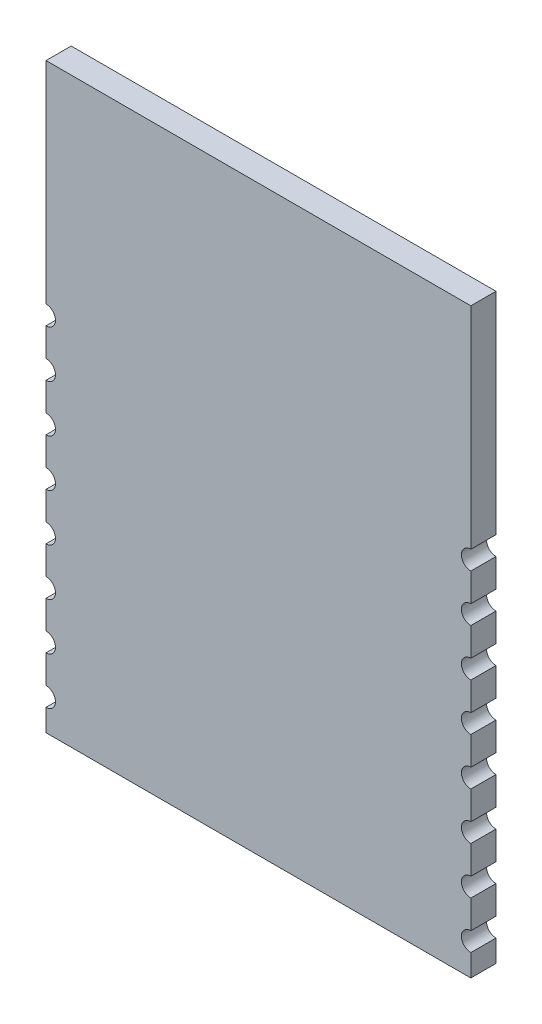
ISO-10303-21;
HEADER;
FILE_DESCRIPTION(('STEP AP214'),'2;1');
FILE_NAME('part.step','',(''),(''),'','','');
FILE_SCHEMA(('AUTOMOTIVE_DESIGN { 1 0 10303 214 1 1 1 1 }'));
ENDSEC;
DATA;
#1=APPLICATION_CONTEXT('core data for automotive mechanical design processes');
#2=APPLICATION_PROTOCOL_DEFINITION('international standard','automotive_design',2000,#1);
#3=PRODUCT_CONTEXT('',#1,'mechanical');
#4=PRODUCT('Part','Part','',(#3));
#5=PRODUCT_RELATED_PRODUCT_CATEGORY('part','',(#4));
#6=PRODUCT_DEFINITION_FORMATION('','',#4);
#7=PRODUCT_DEFINITION_CONTEXT('part definition',#1,'design');
#8=PRODUCT_DEFINITION('design','',#6,#7);
#9=PRODUCT_DEFINITION_SHAPE('','',#8);
#10=(LENGTH_UNIT() NAMED_UNIT(*) SI_UNIT(.MILLI.,.METRE.));
#11=(NAMED_UNIT(*) PLANE_ANGLE_UNIT() SI_UNIT($,.RADIAN.));
#12=(NAMED_UNIT(*) SI_UNIT($,.STERADIAN.) SOLID_ANGLE_UNIT());
#13=UNCERTAINTY_MEASURE_WITH_UNIT(LENGTH_MEASURE(1.E-05),#10,'distance_accuracy_value','');
#14=(GEOMETRIC_REPRESENTATION_CONTEXT(3) GLOBAL_UNCERTAINTY_ASSIGNED_CONTEXT((#13)) GLOBAL_UNIT_ASSIGNED_CONTEXT((#10,
#11,#12)) REPRESENTATION_CONTEXT('',''));
#15=CARTESIAN_POINT('',(0.,0.,0.));
#16=DIRECTION('',(0.,0.,1.));
#17=DIRECTION('',(1.,0.,0.));
#18=AXIS2_PLACEMENT_3D('',#15,#16,#17);
#19=CARTESIAN_POINT('',(0.,18.5,0.8));
#20=DIRECTION('',(1.,0.,0.));
#21=DIRECTION('',(0.,0.,-1.));
#22=AXIS2_PLACEMENT_3D('',#19,#20,#21);
#23=PLANE('',#22);
#24=DIRECTION('',(0.,0.,1.));
#25=VECTOR('',#24,1.);
#26=CARTESIAN_POINT('',(0.,1.3,0.));
#27=LINE('',#26,#25);
#28=CARTESIAN_POINT('',(0.,1.3,0.8));
#29=VERTEX_POINT('',#28);
#30=CARTESIAN_POINT('',(0.,1.3,0.));
#31=VERTEX_POINT('',#30);
#32=EDGE_CURVE('E64',#29,#31,#27,.F.);
#33=ORIENTED_EDGE('',*,*,#32,.F.);
#34=DIRECTION('',(0.,-1.,0.));
#35=VECTOR('',#34,1.);
#36=CARTESIAN_POINT('',(0.,18.5,0.8));
#37=LINE('',#36,#35);
#38=CARTESIAN_POINT('',(0.,2.2,0.8));
#39=VERTEX_POINT('',#38);
#40=EDGE_CURVE('E713',#39,#29,#37,.T.);
#41=ORIENTED_EDGE('',*,*,#40,.F.);
#42=DIRECTION('',(0.,0.,1.));
#43=VECTOR('',#42,1.);
#44=CARTESIAN_POINT('',(0.,2.2,0.));
#45=LINE('',#44,#43);
#46=CARTESIAN_POINT('',(0.,2.2,0.));
#47=VERTEX_POINT('',#46);
#48=EDGE_CURVE('E563',#47,#39,#45,.T.);
#49=ORIENTED_EDGE('',*,*,#48,.F.);
#50=DIRECTION('',(0.,-1.,0.));
#51=VECTOR('',#50,1.);
#52=CARTESIAN_POINT('',(0.,18.5,0.));
#53=LINE('',#52,#51);
#54=EDGE_CURVE('E651',#47,#31,#53,.T.);
#55=ORIENTED_EDGE('',*,*,#54,.T.);
#56=EDGE_LOOP('',(#33,#41,#49,#55));
#57=FACE_BOUND('',#56,.T.);
#58=ADVANCED_FACE('F49',(#57),#23,.F.);
#59=DIRECTION('',(0.,0.,1.));
#60=VECTOR('',#59,1.);
#61=CARTESIAN_POINT('',(0.,0.7,0.));
#62=LINE('',#61,#60);
#63=CARTESIAN_POINT('',(0.,0.7,0.));
#64=VERTEX_POINT('',#63);
#65=CARTESIAN_POINT('',(0.,0.7,0.8));
#66=VERTEX_POINT('',#65);
#67=EDGE_CURVE('E558',#64,#66,#62,.T.);
#68=ORIENTED_EDGE('',*,*,#67,.F.);
#69=CARTESIAN_POINT('',(0.,0.,0.));
#70=VERTEX_POINT('',#69);
#71=EDGE_CURVE('E320',#64,#70,#53,.T.);
#72=ORIENTED_EDGE('',*,*,#71,.T.);
#73=DIRECTION('',(0.,0.,-1.));
#74=VECTOR('',#73,1.);
#75=CARTESIAN_POINT('',(0.,0.,0.8));
#76=LINE('',#75,#74);
#77=CARTESIAN_POINT('',(0.,0.,0.8));
#78=VERTEX_POINT('',#77);
#79=EDGE_CURVE('E11',#78,#70,#76,.T.);
#80=ORIENTED_EDGE('',*,*,#79,.F.);
#81=EDGE_CURVE('E339',#66,#78,#37,.T.);
#82=ORIENTED_EDGE('',*,*,#81,.F.);
#83=EDGE_LOOP('',(#68,#72,#80,#82));
#84=FACE_BOUND('',#83,.T.);
#85=ADVANCED_FACE('F649',(#84),#23,.F.);
#86=DIRECTION('',(0.,0.,1.));
#87=VECTOR('',#86,1.);
#88=CARTESIAN_POINT('',(0.,2.8,0.));
#89=LINE('',#88,#87);
#90=CARTESIAN_POINT('',(0.,2.8,0.8));
#91=VERTEX_POINT('',#90);
#92=CARTESIAN_POINT('',(0.,2.8,0.));
#93=VERTEX_POINT('',#92);
#94=EDGE_CURVE('E72',#91,#93,#89,.F.);
#95=ORIENTED_EDGE('',*,*,#94,.F.);
#96=CARTESIAN_POINT('',(0.,3.7,0.8));
#97=VERTEX_POINT('',#96);
#98=EDGE_CURVE('E708',#97,#91,#37,.T.);
#99=ORIENTED_EDGE('',*,*,#98,.F.);
#100=DIRECTION('',(0.,0.,1.));
#101=VECTOR('',#100,1.);
#102=CARTESIAN_POINT('',(0.,3.7,0.));
#103=LINE('',#102,#101);
#104=CARTESIAN_POINT('',(0.,3.7,0.));
#105=VERTEX_POINT('',#104);
#106=EDGE_CURVE('E569',#105,#97,#103,.T.);
#107=ORIENTED_EDGE('',*,*,#106,.F.);
#108=EDGE_CURVE('E654',#105,#93,#53,.T.);
#109=ORIENTED_EDGE('',*,*,#108,.T.);
#110=EDGE_LOOP('',(#95,#99,#107,#109));
#111=FACE_BOUND('',#110,.T.);
#112=ADVANCED_FACE('F736',(#111),#23,.F.);
#113=DIRECTION('',(0.,0.,1.));
#114=VECTOR('',#113,1.);
#115=CARTESIAN_POINT('',(0.,4.3,0.));
#116=LINE('',#115,#114);
#117=CARTESIAN_POINT('',(0.,4.3,0.8));
#118=VERTEX_POINT('',#117);
#119=CARTESIAN_POINT('',(0.,4.3,0.));
#120=VERTEX_POINT('',#119);
#121=EDGE_CURVE('E566',#118,#120,#116,.F.);
#122=ORIENTED_EDGE('',*,*,#121,.F.);
#123=CARTESIAN_POINT('',(0.,5.2,0.8));
#124=VERTEX_POINT('',#123);
#125=EDGE_CURVE('E702',#124,#118,#37,.T.);
#126=ORIENTED_EDGE('',*,*,#125,.F.);
#127=DIRECTION('',(0.,0.,1.));
#128=VECTOR('',#127,1.);
#129=CARTESIAN_POINT('',(0.,5.2,0.));
#130=LINE('',#129,#128);
#131=CARTESIAN_POINT('',(0.,5.2,0.));
#132=VERTEX_POINT('',#131);
#133=EDGE_CURVE('E575',#132,#124,#130,.T.);
#134=ORIENTED_EDGE('',*,*,#133,.F.);
#135=EDGE_CURVE('E661',#132,#120,#53,.T.);
#136=ORIENTED_EDGE('',*,*,#135,.T.);
#137=EDGE_LOOP('',(#122,#126,#134,#136));
#138=FACE_BOUND('',#137,.T.);
#139=ADVANCED_FACE('F917',(#138),#23,.F.);
#140=DIRECTION('',(0.,0.,1.));
#141=VECTOR('',#140,1.);
#142=CARTESIAN_POINT('',(0.,5.8,0.));
#143=LINE('',#142,#141);
#144=CARTESIAN_POINT('',(0.,5.8,0.8));
#145=VERTEX_POINT('',#144);
#146=CARTESIAN_POINT('',(0.,5.8,0.));
#147=VERTEX_POINT('',#146);
#148=EDGE_CURVE('E572',#145,#147,#143,.F.);
#149=ORIENTED_EDGE('',*,*,#148,.F.);
#150=CARTESIAN_POINT('',(0.,6.7,0.8));
#151=VERTEX_POINT('',#150);
#152=EDGE_CURVE('E699',#151,#145,#37,.T.);
#153=ORIENTED_EDGE('',*,*,#152,.F.);
#154=DIRECTION('',(0.,0.,1.));
#155=VECTOR('',#154,1.);
#156=CARTESIAN_POINT('',(0.,6.7,0.));
#157=LINE('',#156,#155);
#158=CARTESIAN_POINT('',(0.,6.7,0.));
#159=VERTEX_POINT('',#158);
#160=EDGE_CURVE('E580',#159,#151,#157,.T.);
#161=ORIENTED_EDGE('',*,*,#160,.F.);
#162=EDGE_CURVE('E668',#159,#147,#53,.T.);
#163=ORIENTED_EDGE('',*,*,#162,.T.);
#164=EDGE_LOOP('',(#149,#153,#161,#163));
#165=FACE_BOUND('',#164,.T.);
#166=ADVANCED_FACE('F697',(#165),#23,.F.);
#167=DIRECTION('',(0.,0.,1.));
#168=VECTOR('',#167,1.);
#169=CARTESIAN_POINT('',(0.,7.3,0.));
#170=LINE('',#169,#168);
#171=CARTESIAN_POINT('',(0.,7.3,0.8));
#172=VERTEX_POINT('',#171);
#173=CARTESIAN_POINT('',(0.,7.3,0.));
#174=VERTEX_POINT('',#173);
#175=EDGE_CURVE('E578',#172,#174,#170,.F.);
#176=ORIENTED_EDGE('',*,*,#175,.F.);
#177=CARTESIAN_POINT('',(0.,8.2,0.8));
#178=VERTEX_POINT('',#177);
#179=EDGE_CURVE('E701',#178,#172,#37,.T.);
#180=ORIENTED_EDGE('',*,*,#179,.F.);
#181=DIRECTION('',(0.,0.,1.));
#182=VECTOR('',#181,1.);
#183=CARTESIAN_POINT('',(0.,8.2,0.));
#184=LINE('',#183,#182);
#185=CARTESIAN_POINT('',(0.,8.2,0.));
#186=VERTEX_POINT('',#185);
#187=EDGE_CURVE('E586',#186,#178,#184,.T.);
#188=ORIENTED_EDGE('',*,*,#187,.F.);
#189=EDGE_CURVE('E323',#186,#174,#53,.T.);
#190=ORIENTED_EDGE('',*,*,#189,.T.);
#191=EDGE_LOOP('',(#176,#180,#188,#190));
#192=FACE_BOUND('',#191,.T.);
#193=ADVANCED_FACE('F688',(#192),#23,.F.);
#194=DIRECTION('',(0.,0.,1.));
#195=VECTOR('',#194,1.);
#196=CARTESIAN_POINT('',(0.,8.8,0.));
#197=LINE('',#196,#195);
#198=CARTESIAN_POINT('',(0.,8.8,0.8));
#199=VERTEX_POINT('',#198);
#200=CARTESIAN_POINT('',(0.,8.8,0.));
#201=VERTEX_POINT('',#200);
#202=EDGE_CURVE('E583',#199,#201,#197,.F.);
#203=ORIENTED_EDGE('',*,*,#202,.F.);
#204=CARTESIAN_POINT('',(0.,9.7,0.8));
#205=VERTEX_POINT('',#204);
#206=EDGE_CURVE('E705',#205,#199,#37,.T.);
#207=ORIENTED_EDGE('',*,*,#206,.F.);
#208=DIRECTION('',(0.,0.,1.));
#209=VECTOR('',#208,1.);
#210=CARTESIAN_POINT('',(0.,9.7,0.));
#211=LINE('',#210,#209);
#212=CARTESIAN_POINT('',(0.,9.7,0.));
#213=VERTEX_POINT('',#212);
#214=EDGE_CURVE('E592',#213,#205,#211,.T.);
#215=ORIENTED_EDGE('',*,*,#214,.F.);
#216=EDGE_CURVE('E313',#213,#201,#53,.T.);
#217=ORIENTED_EDGE('',*,*,#216,.T.);
#218=EDGE_LOOP('',(#203,#207,#215,#217));
#219=FACE_BOUND('',#218,.T.);
#220=ADVANCED_FACE('F743',(#219),#23,.F.);
#221=DIRECTION('',(0.,0.,1.));
#222=VECTOR('',#221,1.);
#223=CARTESIAN_POINT('',(0.,10.3,0.));
#224=LINE('',#223,#222);
#225=CARTESIAN_POINT('',(0.,10.3,0.8));
#226=VERTEX_POINT('',#225);
#227=CARTESIAN_POINT('',(0.,10.3,0.));
#228=VERTEX_POINT('',#227);
#229=EDGE_CURVE('E589',#226,#228,#224,.F.);
#230=ORIENTED_EDGE('',*,*,#229,.F.);
#231=CARTESIAN_POINT('',(0.,11.2,0.8));
#232=VERTEX_POINT('',#231);
#233=EDGE_CURVE('E303',#232,#226,#37,.T.);
#234=ORIENTED_EDGE('',*,*,#233,.F.);
#235=DIRECTION('',(0.,0.,1.));
#236=VECTOR('',#235,1.);
#237=CARTESIAN_POINT('',(0.,11.2,0.));
#238=LINE('',#237,#236);
#239=CARTESIAN_POINT('',(0.,11.2,0.));
#240=VERTEX_POINT('',#239);
#241=EDGE_CURVE('E284',#240,#232,#238,.T.);
#242=ORIENTED_EDGE('',*,*,#241,.F.);
#243=EDGE_CURVE('E301',#240,#228,#53,.T.);
#244=ORIENTED_EDGE('',*,*,#243,.T.);
#245=EDGE_LOOP('',(#230,#234,#242,#244));
#246=FACE_BOUND('',#245,.T.);
#247=ADVANCED_FACE('F300',(#246),#23,.F.);
#248=DIRECTION('',(0.,0.,1.));
#249=VECTOR('',#248,1.);
#250=CARTESIAN_POINT('',(0.,11.8,0.));
#251=LINE('',#250,#249);
#252=CARTESIAN_POINT('',(0.,11.8,0.8));
#253=VERTEX_POINT('',#252);
#254=CARTESIAN_POINT('',(0.,11.8,0.));
#255=VERTEX_POINT('',#254);
#256=EDGE_CURVE('E287',#253,#255,#251,.F.);
#257=ORIENTED_EDGE('',*,*,#256,.F.);
#258=CARTESIAN_POINT('',(0.,18.5,0.8));
#259=VERTEX_POINT('',#258);
#260=EDGE_CURVE('E387',#259,#253,#37,.T.);
#261=ORIENTED_EDGE('',*,*,#260,.F.);
#262=DIRECTION('',(0.,0.,-1.));
#263=VECTOR('',#262,1.);
#264=CARTESIAN_POINT('',(0.,18.5,0.8));
#265=LINE('',#264,#263);
#266=CARTESIAN_POINT('',(0.,18.5,0.));
#267=VERTEX_POINT('',#266);
#268=EDGE_CURVE('E340',#259,#267,#265,.T.);
#269=ORIENTED_EDGE('',*,*,#268,.T.);
#270=EDGE_CURVE('E312',#267,#255,#53,.T.);
#271=ORIENTED_EDGE('',*,*,#270,.T.);
#272=EDGE_LOOP('',(#257,#261,#269,#271));
#273=FACE_BOUND('',#272,.T.);
#274=ADVANCED_FACE('F733',(#273),#23,.F.);
#275=CARTESIAN_POINT('',(13.5,18.5,0.8));
#276=DIRECTION('',(-1.,0.,0.));
#277=DIRECTION('',(0.,-1.,0.));
#278=AXIS2_PLACEMENT_3D('',#275,#276,#277);
#279=PLANE('',#278);
#280=DIRECTION('',(0.,1.,0.));
#281=VECTOR('',#280,1.);
#282=CARTESIAN_POINT('',(13.5,18.5,0.));
#283=LINE('',#282,#281);
#284=CARTESIAN_POINT('',(13.5,1.3,0.));
#285=VERTEX_POINT('',#284);
#286=CARTESIAN_POINT('',(13.5,2.2,0.));
#287=VERTEX_POINT('',#286);
#288=EDGE_CURVE('E336',#285,#287,#283,.T.);
#289=ORIENTED_EDGE('',*,*,#288,.T.);
#290=DIRECTION('',(0.,0.,1.));
#291=VECTOR('',#290,1.);
#292=CARTESIAN_POINT('',(13.5,2.2,0.));
#293=LINE('',#292,#291);
#294=CARTESIAN_POINT('',(13.5,2.2,0.8));
#295=VERTEX_POINT('',#294);
#296=EDGE_CURVE('E380',#287,#295,#293,.T.);
#297=ORIENTED_EDGE('',*,*,#296,.T.);
#298=DIRECTION('',(0.,1.,0.));
#299=VECTOR('',#298,1.);
#300=CARTESIAN_POINT('',(13.5,18.5,0.8));
#301=LINE('',#300,#299);
#302=CARTESIAN_POINT('',(13.5,1.3,0.8));
#303=VERTEX_POINT('',#302);
#304=EDGE_CURVE('E395',#303,#295,#301,.T.);
#305=ORIENTED_EDGE('',*,*,#304,.F.);
#306=DIRECTION('',(0.,0.,1.));
#307=VECTOR('',#306,1.);
#308=CARTESIAN_POINT('',(13.5,1.3,0.));
#309=LINE('',#308,#307);
#310=EDGE_CURVE('E372',#303,#285,#309,.F.);
#311=ORIENTED_EDGE('',*,*,#310,.T.);
#312=EDGE_LOOP('',(#289,#297,#305,#311));
#313=FACE_BOUND('',#312,.T.);
#314=ADVANCED_FACE('F730',(#313),#279,.F.);
#315=CARTESIAN_POINT('',(13.5,2.8,0.8));
#316=VERTEX_POINT('',#315);
#317=CARTESIAN_POINT('',(13.5,3.7,0.8));
#318=VERTEX_POINT('',#317);
#319=EDGE_CURVE('E403',#316,#318,#301,.T.);
#320=ORIENTED_EDGE('',*,*,#319,.F.);
#321=DIRECTION('',(0.,0.,1.));
#322=VECTOR('',#321,1.);
#323=CARTESIAN_POINT('',(13.5,2.8,0.));
#324=LINE('',#323,#322);
#325=CARTESIAN_POINT('',(13.5,2.8,0.));
#326=VERTEX_POINT('',#325);
#327=EDGE_CURVE('E462',#316,#326,#324,.F.);
#328=ORIENTED_EDGE('',*,*,#327,.T.);
#329=CARTESIAN_POINT('',(13.5,3.7,0.));
#330=VERTEX_POINT('',#329);
#331=EDGE_CURVE('E465',#326,#330,#283,.T.);
#332=ORIENTED_EDGE('',*,*,#331,.T.);
#333=DIRECTION('',(0.,0.,1.));
#334=VECTOR('',#333,1.);
#335=CARTESIAN_POINT('',(13.5,3.7,0.));
#336=LINE('',#335,#334);
#337=EDGE_CURVE('E464',#330,#318,#336,.T.);
#338=ORIENTED_EDGE('',*,*,#337,.T.);
#339=EDGE_LOOP('',(#320,#328,#332,#338));
#340=FACE_BOUND('',#339,.T.);
#341=ADVANCED_FACE('F460',(#340),#279,.F.);
#342=CARTESIAN_POINT('',(13.5,4.3,0.8));
#343=VERTEX_POINT('',#342);
#344=CARTESIAN_POINT('',(13.5,5.2,0.8));
#345=VERTEX_POINT('',#344);
#346=EDGE_CURVE('E436',#343,#345,#301,.T.);
#347=ORIENTED_EDGE('',*,*,#346,.F.);
#348=DIRECTION('',(0.,0.,1.));
#349=VECTOR('',#348,1.);
#350=CARTESIAN_POINT('',(13.5,4.3,0.));
#351=LINE('',#350,#349);
#352=CARTESIAN_POINT('',(13.5,4.3,0.));
#353=VERTEX_POINT('',#352);
#354=EDGE_CURVE('E469',#343,#353,#351,.F.);
#355=ORIENTED_EDGE('',*,*,#354,.T.);
#356=CARTESIAN_POINT('',(13.5,5.2,0.));
#357=VERTEX_POINT('',#356);
#358=EDGE_CURVE('E771',#353,#357,#283,.T.);
#359=ORIENTED_EDGE('',*,*,#358,.T.);
#360=DIRECTION('',(0.,0.,1.));
#361=VECTOR('',#360,1.);
#362=CARTESIAN_POINT('',(13.5,5.2,0.));
#363=LINE('',#362,#361);
#364=EDGE_CURVE('E476',#357,#345,#363,.T.);
#365=ORIENTED_EDGE('',*,*,#364,.T.);
#366=EDGE_LOOP('',(#347,#355,#359,#365));
#367=FACE_BOUND('',#366,.T.);
#368=ADVANCED_FACE('F1037',(#367),#279,.F.);
#369=CARTESIAN_POINT('',(13.5,5.8,0.8));
#370=VERTEX_POINT('',#369);
#371=CARTESIAN_POINT('',(13.5,6.7,0.8));
#372=VERTEX_POINT('',#371);
#373=EDGE_CURVE('E428',#370,#372,#301,.T.);
#374=ORIENTED_EDGE('',*,*,#373,.F.);
#375=DIRECTION('',(0.,0.,1.));
#376=VECTOR('',#375,1.);
#377=CARTESIAN_POINT('',(13.5,5.8,0.));
#378=LINE('',#377,#376);
#379=CARTESIAN_POINT('',(13.5,5.8,0.));
#380=VERTEX_POINT('',#379);
#381=EDGE_CURVE('E482',#370,#380,#378,.F.);
#382=ORIENTED_EDGE('',*,*,#381,.T.);
#383=CARTESIAN_POINT('',(13.5,6.7,0.));
#384=VERTEX_POINT('',#383);
#385=EDGE_CURVE('E766',#380,#384,#283,.T.);
#386=ORIENTED_EDGE('',*,*,#385,.T.);
#387=DIRECTION('',(0.,0.,1.));
#388=VECTOR('',#387,1.);
#389=CARTESIAN_POINT('',(13.5,6.7,0.));
#390=LINE('',#389,#388);
#391=EDGE_CURVE('E485',#384,#372,#390,.T.);
#392=ORIENTED_EDGE('',*,*,#391,.T.);
#393=EDGE_LOOP('',(#374,#382,#386,#392));
#394=FACE_BOUND('',#393,.T.);
#395=ADVANCED_FACE('F1045',(#394),#279,.F.);
#396=CARTESIAN_POINT('',(13.5,7.3,0.8));
#397=VERTEX_POINT('',#396);
#398=CARTESIAN_POINT('',(13.5,8.2,0.8));
#399=VERTEX_POINT('',#398);
#400=EDGE_CURVE('E421',#397,#399,#301,.T.);
#401=ORIENTED_EDGE('',*,*,#400,.F.);
#402=DIRECTION('',(0.,0.,1.));
#403=VECTOR('',#402,1.);
#404=CARTESIAN_POINT('',(13.5,7.3,0.));
#405=LINE('',#404,#403);
#406=CARTESIAN_POINT('',(13.5,7.3,0.));
#407=VERTEX_POINT('',#406);
#408=EDGE_CURVE('E488',#397,#407,#405,.F.);
#409=ORIENTED_EDGE('',*,*,#408,.T.);
#410=CARTESIAN_POINT('',(13.5,8.2,0.));
#411=VERTEX_POINT('',#410);
#412=EDGE_CURVE('E760',#407,#411,#283,.T.);
#413=ORIENTED_EDGE('',*,*,#412,.T.);
#414=DIRECTION('',(0.,0.,1.));
#415=VECTOR('',#414,1.);
#416=CARTESIAN_POINT('',(13.5,8.2,0.));
#417=LINE('',#416,#415);
#418=EDGE_CURVE('E492',#411,#399,#417,.T.);
#419=ORIENTED_EDGE('',*,*,#418,.T.);
#420=EDGE_LOOP('',(#401,#409,#413,#419));
#421=FACE_BOUND('',#420,.T.);
#422=ADVANCED_FACE('F1054',(#421),#279,.F.);
#423=CARTESIAN_POINT('',(13.5,8.8,0.8));
#424=VERTEX_POINT('',#423);
#425=CARTESIAN_POINT('',(13.5,9.7,0.8));
#426=VERTEX_POINT('',#425);
#427=EDGE_CURVE('E413',#424,#426,#301,.T.);
#428=ORIENTED_EDGE('',*,*,#427,.F.);
#429=DIRECTION('',(0.,0.,1.));
#430=VECTOR('',#429,1.);
#431=CARTESIAN_POINT('',(13.5,8.8,0.));
#432=LINE('',#431,#430);
#433=CARTESIAN_POINT('',(13.5,8.8,0.));
#434=VERTEX_POINT('',#433);
#435=EDGE_CURVE('E496',#424,#434,#432,.F.);
#436=ORIENTED_EDGE('',*,*,#435,.T.);
#437=CARTESIAN_POINT('',(13.5,9.7,0.));
#438=VERTEX_POINT('',#437);
#439=EDGE_CURVE('E755',#434,#438,#283,.T.);
#440=ORIENTED_EDGE('',*,*,#439,.T.);
#441=DIRECTION('',(0.,0.,1.));
#442=VECTOR('',#441,1.);
#443=CARTESIAN_POINT('',(13.5,9.7,0.));
#444=LINE('',#443,#442);
#445=EDGE_CURVE('E500',#438,#426,#444,.T.);
#446=ORIENTED_EDGE('',*,*,#445,.T.);
#447=EDGE_LOOP('',(#428,#436,#440,#446));
#448=FACE_BOUND('',#447,.T.);
#449=ADVANCED_FACE('F1062',(#448),#279,.F.);
#450=CARTESIAN_POINT('',(13.5,10.3,0.8));
#451=VERTEX_POINT('',#450);
#452=CARTESIAN_POINT('',(13.5,11.2,0.8));
#453=VERTEX_POINT('',#452);
#454=EDGE_CURVE('E405',#451,#453,#301,.T.);
#455=ORIENTED_EDGE('',*,*,#454,.F.);
#456=DIRECTION('',(0.,0.,1.));
#457=VECTOR('',#456,1.);
#458=CARTESIAN_POINT('',(13.5,10.3,0.));
#459=LINE('',#458,#457);
#460=CARTESIAN_POINT('',(13.5,10.3,0.));
#461=VERTEX_POINT('',#460);
#462=EDGE_CURVE('E503',#451,#461,#459,.F.);
#463=ORIENTED_EDGE('',*,*,#462,.T.);
#464=CARTESIAN_POINT('',(13.5,11.2,0.));
#465=VERTEX_POINT('',#464);
#466=EDGE_CURVE('E752',#461,#465,#283,.T.);
#467=ORIENTED_EDGE('',*,*,#466,.T.);
#468=DIRECTION('',(0.,0.,1.));
#469=VECTOR('',#468,1.);
#470=CARTESIAN_POINT('',(13.5,11.2,0.));
#471=LINE('',#470,#469);
#472=EDGE_CURVE('E507',#465,#453,#471,.T.);
#473=ORIENTED_EDGE('',*,*,#472,.T.);
#474=EDGE_LOOP('',(#455,#463,#467,#473));
#475=FACE_BOUND('',#474,.T.);
#476=ADVANCED_FACE('F731',(#475),#279,.F.);
#477=CARTESIAN_POINT('',(13.5,0.,0.));
#478=VERTEX_POINT('',#477);
#479=CARTESIAN_POINT('',(13.5,0.7,0.));
#480=VERTEX_POINT('',#479);
#481=EDGE_CURVE('E331',#478,#480,#283,.T.);
#482=ORIENTED_EDGE('',*,*,#481,.T.);
#483=DIRECTION('',(0.,0.,1.));
#484=VECTOR('',#483,1.);
#485=CARTESIAN_POINT('',(13.5,0.7,0.));
#486=LINE('',#485,#484);
#487=CARTESIAN_POINT('',(13.5,0.7,0.8));
#488=VERTEX_POINT('',#487);
#489=EDGE_CURVE('E378',#480,#488,#486,.T.);
#490=ORIENTED_EDGE('',*,*,#489,.T.);
#491=CARTESIAN_POINT('',(13.5,0.,0.8));
#492=VERTEX_POINT('',#491);
#493=EDGE_CURVE('E359',#492,#488,#301,.T.);
#494=ORIENTED_EDGE('',*,*,#493,.F.);
#495=DIRECTION('',(0.,0.,-1.));
#496=VECTOR('',#495,1.);
#497=CARTESIAN_POINT('',(13.5,0.,0.8));
#498=LINE('',#497,#496);
#499=EDGE_CURVE('E57',#492,#478,#498,.T.);
#500=ORIENTED_EDGE('',*,*,#499,.T.);
#501=EDGE_LOOP('',(#482,#490,#494,#500));
#502=FACE_BOUND('',#501,.T.);
#503=ADVANCED_FACE('F356',(#502),#279,.F.);
#504=CARTESIAN_POINT('',(0.,0.,0.8));
#505=DIRECTION('',(0.,1.,0.));
#506=DIRECTION('',(0.,0.,1.));
#507=AXIS2_PLACEMENT_3D('',#504,#505,#506);
#508=PLANE('',#507);
#509=DIRECTION('',(1.,0.,0.));
#510=VECTOR('',#509,1.);
#511=CARTESIAN_POINT('',(0.,0.,0.));
#512=LINE('',#511,#510);
#513=EDGE_CURVE('E319',#70,#478,#512,.T.);
#514=ORIENTED_EDGE('',*,*,#513,.T.);
#515=ORIENTED_EDGE('',*,*,#499,.F.);
#516=DIRECTION('',(1.,0.,0.));
#517=VECTOR('',#516,1.);
#518=CARTESIAN_POINT('',(0.,0.,0.8));
#519=LINE('',#518,#517);
#520=EDGE_CURVE('E391',#78,#492,#519,.T.);
#521=ORIENTED_EDGE('',*,*,#520,.F.);
#522=ORIENTED_EDGE('',*,*,#79,.T.);
#523=EDGE_LOOP('',(#514,#515,#521,#522));
#524=FACE_BOUND('',#523,.T.);
#525=ADVANCED_FACE('F721',(#524),#508,.F.);
#526=CARTESIAN_POINT('',(13.5,11.8,0.8));
#527=VERTEX_POINT('',#526);
#528=CARTESIAN_POINT('',(13.5,18.5,0.8));
#529=VERTEX_POINT('',#528);
#530=EDGE_CURVE('E393',#527,#529,#301,.T.);
#531=ORIENTED_EDGE('',*,*,#530,.F.);
#532=DIRECTION('',(0.,0.,1.));
#533=VECTOR('',#532,1.);
#534=CARTESIAN_POINT('',(13.5,11.8,0.));
#535=LINE('',#534,#533);
#536=CARTESIAN_POINT('',(13.5,11.8,0.));
#537=VERTEX_POINT('',#536);
#538=EDGE_CURVE('E510',#527,#537,#535,.F.);
#539=ORIENTED_EDGE('',*,*,#538,.T.);
#540=CARTESIAN_POINT('',(13.5,18.5,0.));
#541=VERTEX_POINT('',#540);
#542=EDGE_CURVE('E330',#537,#541,#283,.T.);
#543=ORIENTED_EDGE('',*,*,#542,.T.);
#544=DIRECTION('',(0.,0.,-1.));
#545=VECTOR('',#544,1.);
#546=CARTESIAN_POINT('',(13.5,18.5,0.8));
#547=LINE('',#546,#545);
#548=EDGE_CURVE('E344',#529,#541,#547,.T.);
#549=ORIENTED_EDGE('',*,*,#548,.F.);
#550=EDGE_LOOP('',(#531,#539,#543,#549));
#551=FACE_BOUND('',#550,.T.);
#552=ADVANCED_FACE('F723',(#551),#279,.F.);
#553=CARTESIAN_POINT('',(0.,18.5,0.8));
#554=DIRECTION('',(0.,-1.,0.));
#555=DIRECTION('',(0.,0.,-1.));
#556=AXIS2_PLACEMENT_3D('',#553,#554,#555);
#557=PLANE('',#556);
#558=DIRECTION('',(-1.,0.,0.));
#559=VECTOR('',#558,1.);
#560=CARTESIAN_POINT('',(0.,18.5,0.));
#561=LINE('',#560,#559);
#562=EDGE_CURVE('E335',#541,#267,#561,.T.);
#563=ORIENTED_EDGE('',*,*,#562,.T.);
#564=ORIENTED_EDGE('',*,*,#268,.F.);
#565=DIRECTION('',(-1.,0.,0.));
#566=VECTOR('',#565,1.);
#567=CARTESIAN_POINT('',(0.,18.5,0.8));
#568=LINE('',#567,#566);
#569=EDGE_CURVE('E326',#529,#259,#568,.T.);
#570=ORIENTED_EDGE('',*,*,#569,.F.);
#571=ORIENTED_EDGE('',*,*,#548,.T.);
#572=EDGE_LOOP('',(#563,#564,#570,#571));
#573=FACE_BOUND('',#572,.T.);
#574=ADVANCED_FACE('F727',(#573),#557,.F.);
#575=CARTESIAN_POINT('',(0.,0.,0.8));
#576=DIRECTION('',(0.,0.,1.));
#577=DIRECTION('',(1.,0.,0.));
#578=AXIS2_PLACEMENT_3D('',#575,#576,#577);
#579=PLANE('',#578);
#580=ORIENTED_EDGE('',*,*,#40,.T.);
#581=CARTESIAN_POINT('',(0.,1.,0.8));
#582=DIRECTION('',(0.,0.,-1.));
#583=DIRECTION('',(-1.,0.,0.));
#584=AXIS2_PLACEMENT_3D('',#581,#582,#583);
#585=CIRCLE('',#584,0.3);
#586=EDGE_CURVE('E637',#29,#66,#585,.T.);
#587=ORIENTED_EDGE('',*,*,#586,.T.);
#588=ORIENTED_EDGE('',*,*,#81,.T.);
#589=ORIENTED_EDGE('',*,*,#520,.T.);
#590=ORIENTED_EDGE('',*,*,#493,.T.);
#591=CARTESIAN_POINT('',(13.5,1.,0.8));
#592=DIRECTION('',(0.,0.,1.));
#593=DIRECTION('',(1.,0.,0.));
#594=AXIS2_PLACEMENT_3D('',#591,#592,#593);
#595=CIRCLE('',#594,0.3);
#596=EDGE_CURVE('E373',#303,#488,#595,.T.);
#597=ORIENTED_EDGE('',*,*,#596,.F.);
#598=ORIENTED_EDGE('',*,*,#304,.T.);
#599=CARTESIAN_POINT('',(13.5,2.5,0.8));
#600=DIRECTION('',(0.,0.,1.));
#601=DIRECTION('',(1.,0.,0.));
#602=AXIS2_PLACEMENT_3D('',#599,#600,#601);
#603=CIRCLE('',#602,0.3);
#604=EDGE_CURVE('E456',#316,#295,#603,.T.);
#605=ORIENTED_EDGE('',*,*,#604,.F.);
#606=ORIENTED_EDGE('',*,*,#319,.T.);
#607=CARTESIAN_POINT('',(13.5,4.,0.8));
#608=DIRECTION('',(0.,0.,1.));
#609=DIRECTION('',(1.,0.,0.));
#610=AXIS2_PLACEMENT_3D('',#607,#608,#609);
#611=CIRCLE('',#610,0.3);
#612=EDGE_CURVE('E455',#343,#318,#611,.T.);
#613=ORIENTED_EDGE('',*,*,#612,.F.);
#614=ORIENTED_EDGE('',*,*,#346,.T.);
#615=CARTESIAN_POINT('',(13.5,5.5,0.8));
#616=DIRECTION('',(0.,0.,1.));
#617=DIRECTION('',(1.,0.,0.));
#618=AXIS2_PLACEMENT_3D('',#615,#616,#617);
#619=CIRCLE('',#618,0.3);
#620=EDGE_CURVE('E541',#370,#345,#619,.T.);
#621=ORIENTED_EDGE('',*,*,#620,.F.);
#622=ORIENTED_EDGE('',*,*,#373,.T.);
#623=CARTESIAN_POINT('',(13.5,7.,0.8));
#624=DIRECTION('',(0.,0.,1.));
#625=DIRECTION('',(1.,0.,0.));
#626=AXIS2_PLACEMENT_3D('',#623,#624,#625);
#627=CIRCLE('',#626,0.3);
#628=EDGE_CURVE('E534',#397,#372,#627,.T.);
#629=ORIENTED_EDGE('',*,*,#628,.F.);
#630=ORIENTED_EDGE('',*,*,#400,.T.);
#631=CARTESIAN_POINT('',(13.5,8.5,0.8));
#632=DIRECTION('',(0.,0.,1.));
#633=DIRECTION('',(1.,0.,0.));
#634=AXIS2_PLACEMENT_3D('',#631,#632,#633);
#635=CIRCLE('',#634,0.3);
#636=EDGE_CURVE('E528',#424,#399,#635,.T.);
#637=ORIENTED_EDGE('',*,*,#636,.F.);
#638=ORIENTED_EDGE('',*,*,#427,.T.);
#639=CARTESIAN_POINT('',(13.5,10.,0.8));
#640=DIRECTION('',(0.,0.,1.));
#641=DIRECTION('',(1.,0.,0.));
#642=AXIS2_PLACEMENT_3D('',#639,#640,#641);
#643=CIRCLE('',#642,0.3);
#644=EDGE_CURVE('E521',#451,#426,#643,.T.);
#645=ORIENTED_EDGE('',*,*,#644,.F.);
#646=ORIENTED_EDGE('',*,*,#454,.T.);
#647=CARTESIAN_POINT('',(13.5,11.5,0.8));
#648=DIRECTION('',(0.,0.,1.));
#649=DIRECTION('',(1.,0.,0.));
#650=AXIS2_PLACEMENT_3D('',#647,#648,#649);
#651=CIRCLE('',#650,0.3);
#652=EDGE_CURVE('E514',#527,#453,#651,.T.);
#653=ORIENTED_EDGE('',*,*,#652,.F.);
#654=ORIENTED_EDGE('',*,*,#530,.T.);
#655=ORIENTED_EDGE('',*,*,#569,.T.);
#656=ORIENTED_EDGE('',*,*,#260,.T.);
#657=CARTESIAN_POINT('',(0.,11.5,0.8));
#658=DIRECTION('',(0.,0.,-1.));
#659=DIRECTION('',(-1.,0.,0.));
#660=AXIS2_PLACEMENT_3D('',#657,#658,#659);
#661=CIRCLE('',#660,0.3);
#662=EDGE_CURVE('E294',#253,#232,#661,.T.);
#663=ORIENTED_EDGE('',*,*,#662,.T.);
#664=ORIENTED_EDGE('',*,*,#233,.T.);
#665=CARTESIAN_POINT('',(0.,10.,0.8));
#666=DIRECTION('',(0.,0.,-1.));
#667=DIRECTION('',(-1.,0.,0.));
#668=AXIS2_PLACEMENT_3D('',#665,#666,#667);
#669=CIRCLE('',#668,0.3);
#670=EDGE_CURVE('E293',#226,#205,#669,.T.);
#671=ORIENTED_EDGE('',*,*,#670,.T.);
#672=ORIENTED_EDGE('',*,*,#206,.T.);
#673=CARTESIAN_POINT('',(0.,8.5,0.8));
#674=DIRECTION('',(0.,0.,-1.));
#675=DIRECTION('',(-1.,0.,0.));
#676=AXIS2_PLACEMENT_3D('',#673,#674,#675);
#677=CIRCLE('',#676,0.3);
#678=EDGE_CURVE('E603',#199,#178,#677,.T.);
#679=ORIENTED_EDGE('',*,*,#678,.T.);
#680=ORIENTED_EDGE('',*,*,#179,.T.);
#681=CARTESIAN_POINT('',(0.,7.,0.8));
#682=DIRECTION('',(0.,0.,-1.));
#683=DIRECTION('',(-1.,0.,0.));
#684=AXIS2_PLACEMENT_3D('',#681,#682,#683);
#685=CIRCLE('',#684,0.3);
#686=EDGE_CURVE('E610',#172,#151,#685,.T.);
#687=ORIENTED_EDGE('',*,*,#686,.T.);
#688=ORIENTED_EDGE('',*,*,#152,.T.);
#689=CARTESIAN_POINT('',(0.,5.5,0.8));
#690=DIRECTION('',(0.,0.,-1.));
#691=DIRECTION('',(-1.,0.,0.));
#692=AXIS2_PLACEMENT_3D('',#689,#690,#691);
#693=CIRCLE('',#692,0.3);
#694=EDGE_CURVE('E617',#145,#124,#693,.T.);
#695=ORIENTED_EDGE('',*,*,#694,.T.);
#696=ORIENTED_EDGE('',*,*,#125,.T.);
#697=CARTESIAN_POINT('',(0.,4.,0.8));
#698=DIRECTION('',(0.,0.,-1.));
#699=DIRECTION('',(-1.,0.,0.));
#700=AXIS2_PLACEMENT_3D('',#697,#698,#699);
#701=CIRCLE('',#700,0.3);
#702=EDGE_CURVE('E624',#118,#97,#701,.T.);
#703=ORIENTED_EDGE('',*,*,#702,.T.);
#704=ORIENTED_EDGE('',*,*,#98,.T.);
#705=CARTESIAN_POINT('',(0.,2.5,0.8));
#706=DIRECTION('',(0.,0.,-1.));
#707=DIRECTION('',(-1.,0.,0.));
#708=AXIS2_PLACEMENT_3D('',#705,#706,#707);
#709=CIRCLE('',#708,0.3);
#710=EDGE_CURVE('E630',#91,#39,#709,.T.);
#711=ORIENTED_EDGE('',*,*,#710,.T.);
#712=EDGE_LOOP('',(#580,#587,#588,#589,#590,#597,#598,#605,#606,#613,#614,#621,#622,#629,#630,
#637,#638,#645,#646,#653,#654,#655,#656,#663,#664,#671,#672,#679,#680,#687,#688,#695,#696,#703,
#704,#711));
#713=FACE_BOUND('',#712,.T.);
#714=ADVANCED_FACE('F454',(#713),#579,.T.);
#715=CARTESIAN_POINT('',(0.,0.,0.));
#716=DIRECTION('',(0.,0.,1.));
#717=DIRECTION('',(1.,0.,0.));
#718=AXIS2_PLACEMENT_3D('',#715,#716,#717);
#719=PLANE('',#718);
#720=CARTESIAN_POINT('',(0.,1.,0.));
#721=DIRECTION('',(0.,0.,-1.));
#722=DIRECTION('',(-1.,0.,0.));
#723=AXIS2_PLACEMENT_3D('',#720,#721,#722);
#724=CIRCLE('',#723,0.3);
#725=EDGE_CURVE('E305',#31,#64,#724,.T.);
#726=ORIENTED_EDGE('',*,*,#725,.F.);
#727=ORIENTED_EDGE('',*,*,#54,.F.);
#728=CARTESIAN_POINT('',(0.,2.5,0.));
#729=DIRECTION('',(0.,0.,-1.));
#730=DIRECTION('',(-1.,0.,0.));
#731=AXIS2_PLACEMENT_3D('',#728,#729,#730);
#732=CIRCLE('',#731,0.3);
#733=EDGE_CURVE('E634',#93,#47,#732,.T.);
#734=ORIENTED_EDGE('',*,*,#733,.F.);
#735=ORIENTED_EDGE('',*,*,#108,.F.);
#736=CARTESIAN_POINT('',(0.,4.,0.));
#737=DIRECTION('',(0.,0.,-1.));
#738=DIRECTION('',(-1.,0.,0.));
#739=AXIS2_PLACEMENT_3D('',#736,#737,#738);
#740=CIRCLE('',#739,0.3);
#741=EDGE_CURVE('E627',#120,#105,#740,.T.);
#742=ORIENTED_EDGE('',*,*,#741,.F.);
#743=ORIENTED_EDGE('',*,*,#135,.F.);
#744=CARTESIAN_POINT('',(0.,5.5,0.));
#745=DIRECTION('',(0.,0.,-1.));
#746=DIRECTION('',(-1.,0.,0.));
#747=AXIS2_PLACEMENT_3D('',#744,#745,#746);
#748=CIRCLE('',#747,0.3);
#749=EDGE_CURVE('E621',#147,#132,#748,.T.);
#750=ORIENTED_EDGE('',*,*,#749,.F.);
#751=ORIENTED_EDGE('',*,*,#162,.F.);
#752=CARTESIAN_POINT('',(0.,7.,0.));
#753=DIRECTION('',(0.,0.,-1.));
#754=DIRECTION('',(-1.,0.,0.));
#755=AXIS2_PLACEMENT_3D('',#752,#753,#754);
#756=CIRCLE('',#755,0.3);
#757=EDGE_CURVE('E614',#174,#159,#756,.T.);
#758=ORIENTED_EDGE('',*,*,#757,.F.);
#759=ORIENTED_EDGE('',*,*,#189,.F.);
#760=CARTESIAN_POINT('',(0.,8.5,0.));
#761=DIRECTION('',(0.,0.,-1.));
#762=DIRECTION('',(-1.,0.,0.));
#763=AXIS2_PLACEMENT_3D('',#760,#761,#762);
#764=CIRCLE('',#763,0.3);
#765=EDGE_CURVE('E607',#201,#186,#764,.T.);
#766=ORIENTED_EDGE('',*,*,#765,.F.);
#767=ORIENTED_EDGE('',*,*,#216,.F.);
#768=CARTESIAN_POINT('',(0.,10.,0.));
#769=DIRECTION('',(0.,0.,-1.));
#770=DIRECTION('',(-1.,0.,0.));
#771=AXIS2_PLACEMENT_3D('',#768,#769,#770);
#772=CIRCLE('',#771,0.3);
#773=EDGE_CURVE('E310',#228,#213,#772,.T.);
#774=ORIENTED_EDGE('',*,*,#773,.F.);
#775=ORIENTED_EDGE('',*,*,#243,.F.);
#776=CARTESIAN_POINT('',(0.,11.5,0.));
#777=DIRECTION('',(0.,0.,-1.));
#778=DIRECTION('',(-1.,0.,0.));
#779=AXIS2_PLACEMENT_3D('',#776,#777,#778);
#780=CIRCLE('',#779,0.3);
#781=EDGE_CURVE('E281',#255,#240,#780,.T.);
#782=ORIENTED_EDGE('',*,*,#781,.F.);
#783=ORIENTED_EDGE('',*,*,#270,.F.);
#784=ORIENTED_EDGE('',*,*,#562,.F.);
#785=ORIENTED_EDGE('',*,*,#542,.F.);
#786=CARTESIAN_POINT('',(13.5,11.5,0.));
#787=DIRECTION('',(0.,0.,1.));
#788=DIRECTION('',(1.,0.,0.));
#789=AXIS2_PLACEMENT_3D('',#786,#787,#788);
#790=CIRCLE('',#789,0.3);
#791=EDGE_CURVE('E517',#537,#465,#790,.T.);
#792=ORIENTED_EDGE('',*,*,#791,.T.);
#793=ORIENTED_EDGE('',*,*,#466,.F.);
#794=CARTESIAN_POINT('',(13.5,10.,0.));
#795=DIRECTION('',(0.,0.,1.));
#796=DIRECTION('',(1.,0.,0.));
#797=AXIS2_PLACEMENT_3D('',#794,#795,#796);
#798=CIRCLE('',#797,0.3);
#799=EDGE_CURVE('E524',#461,#438,#798,.T.);
#800=ORIENTED_EDGE('',*,*,#799,.T.);
#801=ORIENTED_EDGE('',*,*,#439,.F.);
#802=CARTESIAN_POINT('',(13.5,8.5,0.));
#803=DIRECTION('',(0.,0.,1.));
#804=DIRECTION('',(1.,0.,0.));
#805=AXIS2_PLACEMENT_3D('',#802,#803,#804);
#806=CIRCLE('',#805,0.3);
#807=EDGE_CURVE('E530',#434,#411,#806,.T.);
#808=ORIENTED_EDGE('',*,*,#807,.T.);
#809=ORIENTED_EDGE('',*,*,#412,.F.);
#810=CARTESIAN_POINT('',(13.5,7.,0.));
#811=DIRECTION('',(0.,0.,1.));
#812=DIRECTION('',(1.,0.,0.));
#813=AXIS2_PLACEMENT_3D('',#810,#811,#812);
#814=CIRCLE('',#813,0.3);
#815=EDGE_CURVE('E537',#407,#384,#814,.T.);
#816=ORIENTED_EDGE('',*,*,#815,.T.);
#817=ORIENTED_EDGE('',*,*,#385,.F.);
#818=CARTESIAN_POINT('',(13.5,5.5,0.));
#819=DIRECTION('',(0.,0.,1.));
#820=DIRECTION('',(1.,0.,0.));
#821=AXIS2_PLACEMENT_3D('',#818,#819,#820);
#822=CIRCLE('',#821,0.3);
#823=EDGE_CURVE('E544',#380,#357,#822,.T.);
#824=ORIENTED_EDGE('',*,*,#823,.T.);
#825=ORIENTED_EDGE('',*,*,#358,.F.);
#826=CARTESIAN_POINT('',(13.5,4.,0.));
#827=DIRECTION('',(0.,0.,1.));
#828=DIRECTION('',(1.,0.,0.));
#829=AXIS2_PLACEMENT_3D('',#826,#827,#828);
#830=CIRCLE('',#829,0.3);
#831=EDGE_CURVE('E550',#353,#330,#830,.T.);
#832=ORIENTED_EDGE('',*,*,#831,.T.);
#833=ORIENTED_EDGE('',*,*,#331,.F.);
#834=CARTESIAN_POINT('',(13.5,2.5,0.));
#835=DIRECTION('',(0.,0.,1.));
#836=DIRECTION('',(1.,0.,0.));
#837=AXIS2_PLACEMENT_3D('',#834,#835,#836);
#838=CIRCLE('',#837,0.3);
#839=EDGE_CURVE('E513',#326,#287,#838,.T.);
#840=ORIENTED_EDGE('',*,*,#839,.T.);
#841=ORIENTED_EDGE('',*,*,#288,.F.);
#842=CARTESIAN_POINT('',(13.5,1.,0.));
#843=DIRECTION('',(0.,0.,1.));
#844=DIRECTION('',(1.,0.,0.));
#845=AXIS2_PLACEMENT_3D('',#842,#843,#844);
#846=CIRCLE('',#845,0.3);
#847=EDGE_CURVE('E366',#285,#480,#846,.T.);
#848=ORIENTED_EDGE('',*,*,#847,.T.);
#849=ORIENTED_EDGE('',*,*,#481,.F.);
#850=ORIENTED_EDGE('',*,*,#513,.F.);
#851=ORIENTED_EDGE('',*,*,#71,.F.);
#852=EDGE_LOOP('',(#726,#727,#734,#735,#742,#743,#750,#751,#758,#759,#766,#767,#774,#775,#782,
#783,#784,#785,#792,#793,#800,#801,#808,#809,#816,#817,#824,#825,#832,#833,#840,#841,#848,#849,
#850,#851));
#853=FACE_BOUND('',#852,.T.);
#854=ADVANCED_FACE('F308',(#853),#719,.F.);
#855=CARTESIAN_POINT('',(13.5,1.,0.));
#856=DIRECTION('',(0.,0.,1.));
#857=DIRECTION('',(1.,0.,0.));
#858=AXIS2_PLACEMENT_3D('',#855,#856,#857);
#859=CYLINDRICAL_SURFACE('',#858,0.3);
#860=ORIENTED_EDGE('',*,*,#847,.F.);
#861=ORIENTED_EDGE('',*,*,#310,.F.);
#862=ORIENTED_EDGE('',*,*,#596,.T.);
#863=ORIENTED_EDGE('',*,*,#489,.F.);
#864=EDGE_LOOP('',(#860,#861,#862,#863));
#865=FACE_BOUND('',#864,.T.);
#866=ADVANCED_FACE('F786',(#865),#859,.F.);
#867=CARTESIAN_POINT('',(13.5,11.5,0.));
#868=DIRECTION('',(0.,0.,1.));
#869=DIRECTION('',(1.,0.,0.));
#870=AXIS2_PLACEMENT_3D('',#867,#868,#869);
#871=CYLINDRICAL_SURFACE('',#870,0.3);
#872=ORIENTED_EDGE('',*,*,#791,.F.);
#873=ORIENTED_EDGE('',*,*,#538,.F.);
#874=ORIENTED_EDGE('',*,*,#652,.T.);
#875=ORIENTED_EDGE('',*,*,#472,.F.);
#876=EDGE_LOOP('',(#872,#873,#874,#875));
#877=FACE_BOUND('',#876,.T.);
#878=ADVANCED_FACE('F788',(#877),#871,.F.);
#879=CARTESIAN_POINT('',(13.5,10.,0.));
#880=DIRECTION('',(0.,0.,1.));
#881=DIRECTION('',(1.,0.,0.));
#882=AXIS2_PLACEMENT_3D('',#879,#880,#881);
#883=CYLINDRICAL_SURFACE('',#882,0.3);
#884=ORIENTED_EDGE('',*,*,#799,.F.);
#885=ORIENTED_EDGE('',*,*,#462,.F.);
#886=ORIENTED_EDGE('',*,*,#644,.T.);
#887=ORIENTED_EDGE('',*,*,#445,.F.);
#888=EDGE_LOOP('',(#884,#885,#886,#887));
#889=FACE_BOUND('',#888,.T.);
#890=ADVANCED_FACE('F793',(#889),#883,.F.);
#891=CARTESIAN_POINT('',(13.5,8.5,0.));
#892=DIRECTION('',(0.,0.,1.));
#893=DIRECTION('',(1.,0.,0.));
#894=AXIS2_PLACEMENT_3D('',#891,#892,#893);
#895=CYLINDRICAL_SURFACE('',#894,0.3);
#896=ORIENTED_EDGE('',*,*,#807,.F.);
#897=ORIENTED_EDGE('',*,*,#435,.F.);
#898=ORIENTED_EDGE('',*,*,#636,.T.);
#899=ORIENTED_EDGE('',*,*,#418,.F.);
#900=EDGE_LOOP('',(#896,#897,#898,#899));
#901=FACE_BOUND('',#900,.T.);
#902=ADVANCED_FACE('F996',(#901),#895,.F.);
#903=CARTESIAN_POINT('',(13.5,7.,0.));
#904=DIRECTION('',(0.,0.,1.));
#905=DIRECTION('',(1.,0.,0.));
#906=AXIS2_PLACEMENT_3D('',#903,#904,#905);
#907=CYLINDRICAL_SURFACE('',#906,0.3);
#908=ORIENTED_EDGE('',*,*,#815,.F.);
#909=ORIENTED_EDGE('',*,*,#408,.F.);
#910=ORIENTED_EDGE('',*,*,#628,.T.);
#911=ORIENTED_EDGE('',*,*,#391,.F.);
#912=EDGE_LOOP('',(#908,#909,#910,#911));
#913=FACE_BOUND('',#912,.T.);
#914=ADVANCED_FACE('F986',(#913),#907,.F.);
#915=CARTESIAN_POINT('',(13.5,5.5,0.));
#916=DIRECTION('',(0.,0.,1.));
#917=DIRECTION('',(1.,0.,0.));
#918=AXIS2_PLACEMENT_3D('',#915,#916,#917);
#919=CYLINDRICAL_SURFACE('',#918,0.3);
#920=ORIENTED_EDGE('',*,*,#823,.F.);
#921=ORIENTED_EDGE('',*,*,#381,.F.);
#922=ORIENTED_EDGE('',*,*,#620,.T.);
#923=ORIENTED_EDGE('',*,*,#364,.F.);
#924=EDGE_LOOP('',(#920,#921,#922,#923));
#925=FACE_BOUND('',#924,.T.);
#926=ADVANCED_FACE('F977',(#925),#919,.F.);
#927=CARTESIAN_POINT('',(13.5,4.,0.));
#928=DIRECTION('',(0.,0.,1.));
#929=DIRECTION('',(1.,0.,0.));
#930=AXIS2_PLACEMENT_3D('',#927,#928,#929);
#931=CYLINDRICAL_SURFACE('',#930,0.3);
#932=ORIENTED_EDGE('',*,*,#831,.F.);
#933=ORIENTED_EDGE('',*,*,#354,.F.);
#934=ORIENTED_EDGE('',*,*,#612,.T.);
#935=ORIENTED_EDGE('',*,*,#337,.F.);
#936=EDGE_LOOP('',(#932,#933,#934,#935));
#937=FACE_BOUND('',#936,.T.);
#938=ADVANCED_FACE('F967',(#937),#931,.F.);
#939=CARTESIAN_POINT('',(13.5,2.5,0.));
#940=DIRECTION('',(0.,0.,1.));
#941=DIRECTION('',(1.,0.,0.));
#942=AXIS2_PLACEMENT_3D('',#939,#940,#941);
#943=CYLINDRICAL_SURFACE('',#942,0.3);
#944=ORIENTED_EDGE('',*,*,#839,.F.);
#945=ORIENTED_EDGE('',*,*,#327,.F.);
#946=ORIENTED_EDGE('',*,*,#604,.T.);
#947=ORIENTED_EDGE('',*,*,#296,.F.);
#948=EDGE_LOOP('',(#944,#945,#946,#947));
#949=FACE_BOUND('',#948,.T.);
#950=ADVANCED_FACE('F823',(#949),#943,.F.);
#951=CARTESIAN_POINT('',(0.,11.5,0.));
#952=DIRECTION('',(0.,0.,1.));
#953=DIRECTION('',(1.,0.,0.));
#954=AXIS2_PLACEMENT_3D('',#951,#952,#953);
#955=CYLINDRICAL_SURFACE('',#954,0.3);
#956=ORIENTED_EDGE('',*,*,#256,.T.);
#957=ORIENTED_EDGE('',*,*,#781,.T.);
#958=ORIENTED_EDGE('',*,*,#241,.T.);
#959=ORIENTED_EDGE('',*,*,#662,.F.);
#960=EDGE_LOOP('',(#956,#957,#958,#959));
#961=FACE_BOUND('',#960,.T.);
#962=ADVANCED_FACE('F283',(#961),#955,.F.);
#963=CARTESIAN_POINT('',(0.,10.,0.));
#964=DIRECTION('',(0.,0.,1.));
#965=DIRECTION('',(1.,0.,0.));
#966=AXIS2_PLACEMENT_3D('',#963,#964,#965);
#967=CYLINDRICAL_SURFACE('',#966,0.3);
#968=ORIENTED_EDGE('',*,*,#229,.T.);
#969=ORIENTED_EDGE('',*,*,#773,.T.);
#970=ORIENTED_EDGE('',*,*,#214,.T.);
#971=ORIENTED_EDGE('',*,*,#670,.F.);
#972=EDGE_LOOP('',(#968,#969,#970,#971));
#973=FACE_BOUND('',#972,.T.);
#974=ADVANCED_FACE('F822',(#973),#967,.F.);
#975=CARTESIAN_POINT('',(0.,8.5,0.));
#976=DIRECTION('',(0.,0.,1.));
#977=DIRECTION('',(1.,0.,0.));
#978=AXIS2_PLACEMENT_3D('',#975,#976,#977);
#979=CYLINDRICAL_SURFACE('',#978,0.3);
#980=ORIENTED_EDGE('',*,*,#202,.T.);
#981=ORIENTED_EDGE('',*,*,#765,.T.);
#982=ORIENTED_EDGE('',*,*,#187,.T.);
#983=ORIENTED_EDGE('',*,*,#678,.F.);
#984=EDGE_LOOP('',(#980,#981,#982,#983));
#985=FACE_BOUND('',#984,.T.);
#986=ADVANCED_FACE('F834',(#985),#979,.F.);
#987=CARTESIAN_POINT('',(0.,7.,0.));
#988=DIRECTION('',(0.,0.,1.));
#989=DIRECTION('',(1.,0.,0.));
#990=AXIS2_PLACEMENT_3D('',#987,#988,#989);
#991=CYLINDRICAL_SURFACE('',#990,0.3);
#992=ORIENTED_EDGE('',*,*,#175,.T.);
#993=ORIENTED_EDGE('',*,*,#757,.T.);
#994=ORIENTED_EDGE('',*,*,#160,.T.);
#995=ORIENTED_EDGE('',*,*,#686,.F.);
#996=EDGE_LOOP('',(#992,#993,#994,#995));
#997=FACE_BOUND('',#996,.T.);
#998=ADVANCED_FACE('F695',(#997),#991,.F.);
#999=CARTESIAN_POINT('',(0.,5.5,0.));
#1000=DIRECTION('',(0.,0.,1.));
#1001=DIRECTION('',(1.,0.,0.));
#1002=AXIS2_PLACEMENT_3D('',#999,#1000,#1001);
#1003=CYLINDRICAL_SURFACE('',#1002,0.3);
#1004=ORIENTED_EDGE('',*,*,#148,.T.);
#1005=ORIENTED_EDGE('',*,*,#749,.T.);
#1006=ORIENTED_EDGE('',*,*,#133,.T.);
#1007=ORIENTED_EDGE('',*,*,#694,.F.);
#1008=EDGE_LOOP('',(#1004,#1005,#1006,#1007));
#1009=FACE_BOUND('',#1008,.T.);
#1010=ADVANCED_FACE('F853',(#1009),#1003,.F.);
#1011=CARTESIAN_POINT('',(0.,4.,0.));
#1012=DIRECTION('',(0.,0.,1.));
#1013=DIRECTION('',(1.,0.,0.));
#1014=AXIS2_PLACEMENT_3D('',#1011,#1012,#1013);
#1015=CYLINDRICAL_SURFACE('',#1014,0.3);
#1016=ORIENTED_EDGE('',*,*,#121,.T.);
#1017=ORIENTED_EDGE('',*,*,#741,.T.);
#1018=ORIENTED_EDGE('',*,*,#106,.T.);
#1019=ORIENTED_EDGE('',*,*,#702,.F.);
#1020=EDGE_LOOP('',(#1016,#1017,#1018,#1019));
#1021=FACE_BOUND('',#1020,.T.);
#1022=ADVANCED_FACE('F862',(#1021),#1015,.F.);
#1023=CARTESIAN_POINT('',(0.,2.5,0.));
#1024=DIRECTION('',(0.,0.,1.));
#1025=DIRECTION('',(1.,0.,0.));
#1026=AXIS2_PLACEMENT_3D('',#1023,#1024,#1025);
#1027=CYLINDRICAL_SURFACE('',#1026,0.3);
#1028=ORIENTED_EDGE('',*,*,#94,.T.);
#1029=ORIENTED_EDGE('',*,*,#733,.T.);
#1030=ORIENTED_EDGE('',*,*,#48,.T.);
#1031=ORIENTED_EDGE('',*,*,#710,.F.);
#1032=EDGE_LOOP('',(#1028,#1029,#1030,#1031));
#1033=FACE_BOUND('',#1032,.T.);
#1034=ADVANCED_FACE('F872',(#1033),#1027,.F.);
#1035=CARTESIAN_POINT('',(0.,1.,0.));
#1036=DIRECTION('',(0.,0.,1.));
#1037=DIRECTION('',(1.,0.,0.));
#1038=AXIS2_PLACEMENT_3D('',#1035,#1036,#1037);
#1039=CYLINDRICAL_SURFACE('',#1038,0.3);
#1040=ORIENTED_EDGE('',*,*,#32,.T.);
#1041=ORIENTED_EDGE('',*,*,#725,.T.);
#1042=ORIENTED_EDGE('',*,*,#67,.T.);
#1043=ORIENTED_EDGE('',*,*,#586,.F.);
#1044=EDGE_LOOP('',(#1040,#1041,#1042,#1043));
#1045=FACE_BOUND('',#1044,.T.);
#1046=ADVANCED_FACE('F644',(#1045),#1039,.F.);
#1047=CLOSED_SHELL('',(#58,#85,#112,#139,#166,#193,#220,#247,#274,#314,#341,#368,#395,#422,#449,
#476,#503,#525,#552,#574,#714,#854,#866,#878,#890,#902,#914,#926,#938,#950,#962,#974,#986,#998,
#1010,#1022,#1034,#1046));
#1048=MANIFOLD_SOLID_BREP('B2',#1047);
#1049=ADVANCED_BREP_SHAPE_REPRESENTATION('',(#18,#1048),#14);
#1050=SHAPE_DEFINITION_REPRESENTATION(#9,#1049);
ENDSEC;
END-ISO-10303-21;
